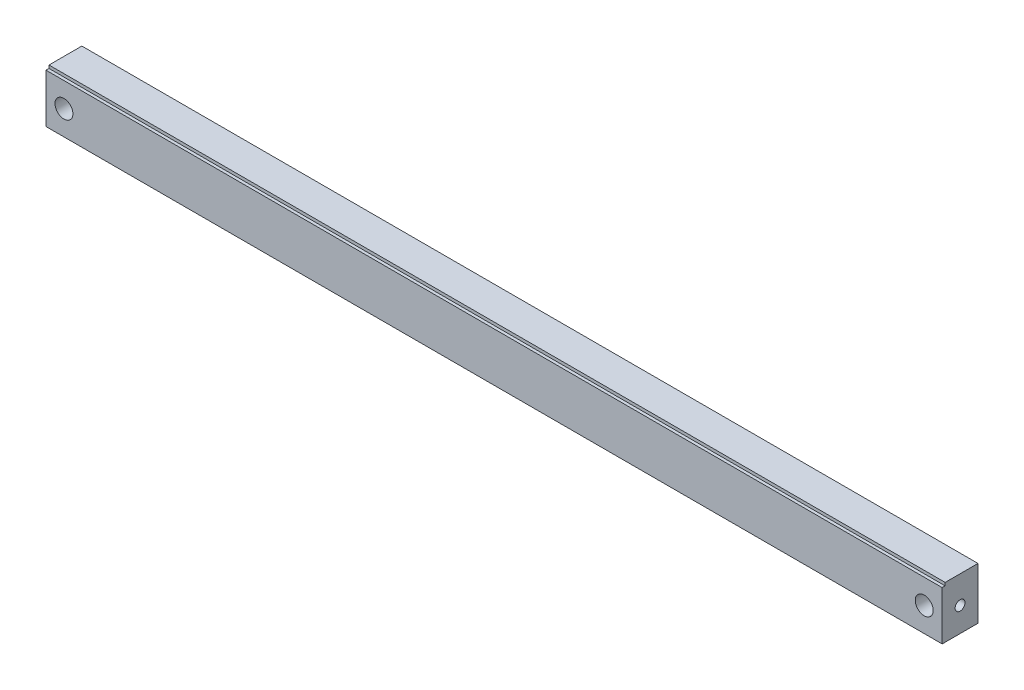
ISO-10303-21;
HEADER;
FILE_DESCRIPTION(('STEP AP214'),'2;1');
FILE_NAME('part.step','',(''),(''),'','','');
FILE_SCHEMA(('AUTOMOTIVE_DESIGN { 1 0 10303 214 1 1 1 1 }'));
ENDSEC;
DATA;
#1=APPLICATION_CONTEXT('core data for automotive mechanical design processes');
#2=APPLICATION_PROTOCOL_DEFINITION('international standard','automotive_design',2000,#1);
#3=PRODUCT_CONTEXT('',#1,'mechanical');
#4=PRODUCT('Part','Part','',(#3));
#5=PRODUCT_RELATED_PRODUCT_CATEGORY('part','',(#4));
#6=PRODUCT_DEFINITION_FORMATION('','',#4);
#7=PRODUCT_DEFINITION_CONTEXT('part definition',#1,'design');
#8=PRODUCT_DEFINITION('design','',#6,#7);
#9=PRODUCT_DEFINITION_SHAPE('','',#8);
#10=(LENGTH_UNIT() NAMED_UNIT(*) SI_UNIT(.MILLI.,.METRE.));
#11=(NAMED_UNIT(*) PLANE_ANGLE_UNIT() SI_UNIT($,.RADIAN.));
#12=(NAMED_UNIT(*) SI_UNIT($,.STERADIAN.) SOLID_ANGLE_UNIT());
#13=UNCERTAINTY_MEASURE_WITH_UNIT(LENGTH_MEASURE(1.E-05),#10,'distance_accuracy_value','');
#14=(GEOMETRIC_REPRESENTATION_CONTEXT(3) GLOBAL_UNCERTAINTY_ASSIGNED_CONTEXT((#13)) GLOBAL_UNIT_ASSIGNED_CONTEXT((#10,
#11,#12)) REPRESENTATION_CONTEXT('',''));
#15=CARTESIAN_POINT('',(0.,0.,0.));
#16=DIRECTION('',(0.,0.,1.));
#17=DIRECTION('',(1.,0.,0.));
#18=AXIS2_PLACEMENT_3D('',#15,#16,#17);
#19=CARTESIAN_POINT('',(-150.,17.35,-12.));
#20=DIRECTION('',(1.,0.,0.));
#21=DIRECTION('',(0.,0.,-1.));
#22=AXIS2_PLACEMENT_3D('',#19,#20,#21);
#23=PLANE('',#22);
#24=CARTESIAN_POINT('',(-150.,8.17500000000004,-6.00000000000003));
#25=DIRECTION('',(-1.,0.,0.));
#26=DIRECTION('',(0.,0.,1.));
#27=AXIS2_PLACEMENT_3D('',#24,#25,#26);
#28=CIRCLE('',#27,1.64999999999999);
#29=CARTESIAN_POINT('',(-150.,8.17500000000004,-4.35000000000004));
#30=VERTEX_POINT('',#29);
#31=EDGE_CURVE('E199',#30,#30,#28,.T.);
#32=ORIENTED_EDGE('',*,*,#31,.F.);
#33=EDGE_LOOP('',(#32));
#34=FACE_BOUND('',#33,.T.);
#35=DIRECTION('',(0.,0.,1.));
#36=VECTOR('',#35,1.);
#37=CARTESIAN_POINT('',(-150.,16.35,0.));
#38=LINE('',#37,#36);
#39=CARTESIAN_POINT('',(-150.,16.35,-1.00000000000003));
#40=VERTEX_POINT('',#39);
#41=CARTESIAN_POINT('',(-150.,16.35,0.));
#42=VERTEX_POINT('',#41);
#43=EDGE_CURVE('E230',#40,#42,#38,.T.);
#44=ORIENTED_EDGE('',*,*,#43,.F.);
#45=DIRECTION('',(0.,1.,0.));
#46=VECTOR('',#45,1.);
#47=CARTESIAN_POINT('',(-150.,16.35,-1.00000000000003));
#48=LINE('',#47,#46);
#49=CARTESIAN_POINT('',(-150.,17.35,-1.00000000000003));
#50=VERTEX_POINT('',#49);
#51=EDGE_CURVE('E119',#40,#50,#48,.T.);
#52=ORIENTED_EDGE('',*,*,#51,.T.);
#53=DIRECTION('',(0.,0.,1.));
#54=VECTOR('',#53,1.);
#55=CARTESIAN_POINT('',(-150.,17.35,-12.));
#56=LINE('',#55,#54);
#57=CARTESIAN_POINT('',(-150.,17.35,-12.));
#58=VERTEX_POINT('',#57);
#59=EDGE_CURVE('E103',#58,#50,#56,.T.);
#60=ORIENTED_EDGE('',*,*,#59,.F.);
#61=DIRECTION('',(0.,-1.,0.));
#62=VECTOR('',#61,1.);
#63=CARTESIAN_POINT('',(-150.,17.35,-12.));
#64=LINE('',#63,#62);
#65=CARTESIAN_POINT('',(-150.,0.,-12.));
#66=VERTEX_POINT('',#65);
#67=EDGE_CURVE('E95',#58,#66,#64,.T.);
#68=ORIENTED_EDGE('',*,*,#67,.T.);
#69=DIRECTION('',(0.,0.,1.));
#70=VECTOR('',#69,1.);
#71=CARTESIAN_POINT('',(-150.,0.,-12.));
#72=LINE('',#71,#70);
#73=CARTESIAN_POINT('',(-150.,0.,0.));
#74=VERTEX_POINT('',#73);
#75=EDGE_CURVE('E110',#66,#74,#72,.T.);
#76=ORIENTED_EDGE('',*,*,#75,.T.);
#77=DIRECTION('',(0.,-1.,0.));
#78=VECTOR('',#77,1.);
#79=CARTESIAN_POINT('',(-150.,17.35,0.));
#80=LINE('',#79,#78);
#81=EDGE_CURVE('E11',#42,#74,#80,.T.);
#82=ORIENTED_EDGE('',*,*,#81,.F.);
#83=EDGE_LOOP('',(#44,#52,#60,#68,#76,#82));
#84=FACE_BOUND('',#83,.T.);
#85=ADVANCED_FACE('F43',(#34,#84),#23,.F.);
#86=CARTESIAN_POINT('',(-150.,17.35,0.));
#87=DIRECTION('',(0.,0.,-1.));
#88=DIRECTION('',(-1.,0.,0.));
#89=AXIS2_PLACEMENT_3D('',#86,#87,#88);
#90=PLANE('',#89);
#91=CARTESIAN_POINT('',(-144.,8.17500000000003,0.));
#92=DIRECTION('',(0.,0.,1.));
#93=DIRECTION('',(1.,0.,0.));
#94=AXIS2_PLACEMENT_3D('',#91,#92,#93);
#95=CIRCLE('',#94,2.99999999999999);
#96=CARTESIAN_POINT('',(-141.,8.17500000000003,0.));
#97=VERTEX_POINT('',#96);
#98=EDGE_CURVE('E218',#97,#97,#95,.T.);
#99=ORIENTED_EDGE('',*,*,#98,.F.);
#100=EDGE_LOOP('',(#99));
#101=FACE_BOUND('',#100,.T.);
#102=CARTESIAN_POINT('',(144.,8.17500000000004,0.));
#103=DIRECTION('',(0.,0.,1.));
#104=DIRECTION('',(1.,0.,0.));
#105=AXIS2_PLACEMENT_3D('',#102,#103,#104);
#106=CIRCLE('',#105,2.99999999999999);
#107=CARTESIAN_POINT('',(147.,8.17500000000004,0.));
#108=VERTEX_POINT('',#107);
#109=EDGE_CURVE('E226',#108,#108,#106,.T.);
#110=ORIENTED_EDGE('',*,*,#109,.F.);
#111=EDGE_LOOP('',(#110));
#112=FACE_BOUND('',#111,.T.);
#113=DIRECTION('',(0.,-1.,0.));
#114=VECTOR('',#113,1.);
#115=CARTESIAN_POINT('',(150.,17.35,0.));
#116=LINE('',#115,#114);
#117=CARTESIAN_POINT('',(150.,16.35,0.));
#118=VERTEX_POINT('',#117);
#119=CARTESIAN_POINT('',(150.,0.,0.));
#120=VERTEX_POINT('',#119);
#121=EDGE_CURVE('E57',#118,#120,#116,.T.);
#122=ORIENTED_EDGE('',*,*,#121,.F.);
#123=DIRECTION('',(1.,0.,0.));
#124=VECTOR('',#123,1.);
#125=CARTESIAN_POINT('',(-150.,16.35,0.));
#126=LINE('',#125,#124);
#127=EDGE_CURVE('E234',#42,#118,#126,.T.);
#128=ORIENTED_EDGE('',*,*,#127,.F.);
#129=ORIENTED_EDGE('',*,*,#81,.T.);
#130=DIRECTION('',(1.,0.,0.));
#131=VECTOR('',#130,1.);
#132=CARTESIAN_POINT('',(-150.,0.,0.));
#133=LINE('',#132,#131);
#134=EDGE_CURVE('E117',#74,#120,#133,.T.);
#135=ORIENTED_EDGE('',*,*,#134,.T.);
#136=EDGE_LOOP('',(#122,#128,#129,#135));
#137=FACE_BOUND('',#136,.T.);
#138=ADVANCED_FACE('F190',(#101,#112,#137),#90,.F.);
#139=CARTESIAN_POINT('',(150.,17.35,-12.0000000000001));
#140=DIRECTION('',(-1.,0.,0.));
#141=DIRECTION('',(0.,0.,1.));
#142=AXIS2_PLACEMENT_3D('',#139,#140,#141);
#143=PLANE('',#142);
#144=CARTESIAN_POINT('',(150.,8.17500000000004,-6.00000000000003));
#145=DIRECTION('',(1.,0.,0.));
#146=DIRECTION('',(0.,0.,-1.));
#147=AXIS2_PLACEMENT_3D('',#144,#145,#146);
#148=CIRCLE('',#147,1.64999999999999);
#149=CARTESIAN_POINT('',(150.,8.17500000000004,-7.65000000000002));
#150=VERTEX_POINT('',#149);
#151=EDGE_CURVE('E206',#150,#150,#148,.T.);
#152=ORIENTED_EDGE('',*,*,#151,.F.);
#153=EDGE_LOOP('',(#152));
#154=FACE_BOUND('',#153,.T.);
#155=DIRECTION('',(0.,0.,-1.));
#156=VECTOR('',#155,1.);
#157=CARTESIAN_POINT('',(150.,17.35,-12.0000000000001));
#158=LINE('',#157,#156);
#159=CARTESIAN_POINT('',(150.,17.35,-1.00000000000003));
#160=VERTEX_POINT('',#159);
#161=CARTESIAN_POINT('',(150.,17.35,-12.0000000000001));
#162=VERTEX_POINT('',#161);
#163=EDGE_CURVE('E251',#160,#162,#158,.T.);
#164=ORIENTED_EDGE('',*,*,#163,.F.);
#165=DIRECTION('',(0.,1.,0.));
#166=VECTOR('',#165,1.);
#167=CARTESIAN_POINT('',(150.,16.35,-1.00000000000003));
#168=LINE('',#167,#166);
#169=CARTESIAN_POINT('',(150.,16.35,-1.00000000000003));
#170=VERTEX_POINT('',#169);
#171=EDGE_CURVE('E65',#170,#160,#168,.T.);
#172=ORIENTED_EDGE('',*,*,#171,.F.);
#173=DIRECTION('',(0.,0.,-1.));
#174=VECTOR('',#173,1.);
#175=CARTESIAN_POINT('',(150.,16.35,0.));
#176=LINE('',#175,#174);
#177=EDGE_CURVE('E238',#118,#170,#176,.T.);
#178=ORIENTED_EDGE('',*,*,#177,.F.);
#179=ORIENTED_EDGE('',*,*,#121,.T.);
#180=DIRECTION('',(0.,0.,-1.));
#181=VECTOR('',#180,1.);
#182=CARTESIAN_POINT('',(150.,0.,-12.0000000000001));
#183=LINE('',#182,#181);
#184=CARTESIAN_POINT('',(150.,0.,-12.0000000000001));
#185=VERTEX_POINT('',#184);
#186=EDGE_CURVE('E104',#120,#185,#183,.T.);
#187=ORIENTED_EDGE('',*,*,#186,.T.);
#188=DIRECTION('',(0.,-1.,0.));
#189=VECTOR('',#188,1.);
#190=CARTESIAN_POINT('',(150.,17.35,-12.0000000000001));
#191=LINE('',#190,#189);
#192=EDGE_CURVE('E98',#162,#185,#191,.T.);
#193=ORIENTED_EDGE('',*,*,#192,.F.);
#194=EDGE_LOOP('',(#164,#172,#178,#179,#187,#193));
#195=FACE_BOUND('',#194,.T.);
#196=ADVANCED_FACE('F195',(#154,#195),#143,.F.);
#197=CARTESIAN_POINT('',(-150.,17.35,-12.));
#198=DIRECTION('',(0.,0.,1.));
#199=DIRECTION('',(1.,0.,0.));
#200=AXIS2_PLACEMENT_3D('',#197,#198,#199);
#201=PLANE('',#200);
#202=CARTESIAN_POINT('',(-144.,8.17500000000003,-12.0000000000001));
#203=DIRECTION('',(0.,0.,1.));
#204=DIRECTION('',(1.,0.,0.));
#205=AXIS2_PLACEMENT_3D('',#202,#203,#204);
#206=CIRCLE('',#205,2.99999999999999);
#207=CARTESIAN_POINT('',(-141.,8.17500000000003,-12.0000000000001));
#208=VERTEX_POINT('',#207);
#209=EDGE_CURVE('E213',#208,#208,#206,.T.);
#210=ORIENTED_EDGE('',*,*,#209,.T.);
#211=EDGE_LOOP('',(#210));
#212=FACE_BOUND('',#211,.T.);
#213=CARTESIAN_POINT('',(144.,8.17500000000004,-12.0000000000001));
#214=DIRECTION('',(0.,0.,1.));
#215=DIRECTION('',(1.,0.,0.));
#216=AXIS2_PLACEMENT_3D('',#213,#214,#215);
#217=CIRCLE('',#216,2.99999999999999);
#218=CARTESIAN_POINT('',(147.,8.17500000000004,-12.0000000000001));
#219=VERTEX_POINT('',#218);
#220=EDGE_CURVE('E222',#219,#219,#217,.T.);
#221=ORIENTED_EDGE('',*,*,#220,.T.);
#222=EDGE_LOOP('',(#221));
#223=FACE_BOUND('',#222,.T.);
#224=DIRECTION('',(-1.,0.,0.));
#225=VECTOR('',#224,1.);
#226=CARTESIAN_POINT('',(-150.,0.,-12.));
#227=LINE('',#226,#225);
#228=EDGE_CURVE('E92',#185,#66,#227,.T.);
#229=ORIENTED_EDGE('',*,*,#228,.T.);
#230=ORIENTED_EDGE('',*,*,#67,.F.);
#231=DIRECTION('',(-1.,0.,0.));
#232=VECTOR('',#231,1.);
#233=CARTESIAN_POINT('',(-150.,17.35,-12.));
#234=LINE('',#233,#232);
#235=EDGE_CURVE('E74',#162,#58,#234,.T.);
#236=ORIENTED_EDGE('',*,*,#235,.F.);
#237=ORIENTED_EDGE('',*,*,#192,.T.);
#238=EDGE_LOOP('',(#229,#230,#236,#237));
#239=FACE_BOUND('',#238,.T.);
#240=ADVANCED_FACE('F94',(#212,#223,#239),#201,.F.);
#241=CARTESIAN_POINT('',(0.,17.35,0.));
#242=DIRECTION('',(0.,1.,0.));
#243=DIRECTION('',(0.,0.,1.));
#244=AXIS2_PLACEMENT_3D('',#241,#242,#243);
#245=PLANE('',#244);
#246=DIRECTION('',(-1.,0.,0.));
#247=VECTOR('',#246,1.);
#248=CARTESIAN_POINT('',(-150.,17.35,-1.00000000000003));
#249=LINE('',#248,#247);
#250=EDGE_CURVE('E217',#160,#50,#249,.T.);
#251=ORIENTED_EDGE('',*,*,#250,.F.);
#252=ORIENTED_EDGE('',*,*,#163,.T.);
#253=ORIENTED_EDGE('',*,*,#235,.T.);
#254=ORIENTED_EDGE('',*,*,#59,.T.);
#255=EDGE_LOOP('',(#251,#252,#253,#254));
#256=FACE_BOUND('',#255,.T.);
#257=ADVANCED_FACE('F255',(#256),#245,.T.);
#258=CARTESIAN_POINT('',(0.,0.,0.));
#259=DIRECTION('',(0.,1.,0.));
#260=DIRECTION('',(0.,0.,1.));
#261=AXIS2_PLACEMENT_3D('',#258,#259,#260);
#262=PLANE('',#261);
#263=ORIENTED_EDGE('',*,*,#75,.F.);
#264=ORIENTED_EDGE('',*,*,#228,.F.);
#265=ORIENTED_EDGE('',*,*,#186,.F.);
#266=ORIENTED_EDGE('',*,*,#134,.F.);
#267=EDGE_LOOP('',(#263,#264,#265,#266));
#268=FACE_BOUND('',#267,.T.);
#269=ADVANCED_FACE('F115',(#268),#262,.F.);
#270=CARTESIAN_POINT('',(-150.,16.35,-1.00000000000003));
#271=DIRECTION('',(0.,0.,-1.));
#272=DIRECTION('',(-1.,0.,0.));
#273=AXIS2_PLACEMENT_3D('',#270,#271,#272);
#274=PLANE('',#273);
#275=ORIENTED_EDGE('',*,*,#250,.T.);
#276=ORIENTED_EDGE('',*,*,#51,.F.);
#277=DIRECTION('',(-1.,0.,0.));
#278=VECTOR('',#277,1.);
#279=CARTESIAN_POINT('',(-150.,16.35,-1.00000000000003));
#280=LINE('',#279,#278);
#281=EDGE_CURVE('E242',#170,#40,#280,.T.);
#282=ORIENTED_EDGE('',*,*,#281,.F.);
#283=ORIENTED_EDGE('',*,*,#171,.T.);
#284=EDGE_LOOP('',(#275,#276,#282,#283));
#285=FACE_BOUND('',#284,.T.);
#286=ADVANCED_FACE('F274',(#285),#274,.F.);
#287=CARTESIAN_POINT('',(0.,16.35,0.));
#288=DIRECTION('',(0.,-1.,0.));
#289=DIRECTION('',(0.,0.,-1.));
#290=AXIS2_PLACEMENT_3D('',#287,#288,#289);
#291=PLANE('',#290);
#292=ORIENTED_EDGE('',*,*,#43,.T.);
#293=ORIENTED_EDGE('',*,*,#127,.T.);
#294=ORIENTED_EDGE('',*,*,#177,.T.);
#295=ORIENTED_EDGE('',*,*,#281,.T.);
#296=EDGE_LOOP('',(#292,#293,#294,#295));
#297=FACE_BOUND('',#296,.T.);
#298=ADVANCED_FACE('F275',(#297),#291,.F.);
#299=CARTESIAN_POINT('',(144.,8.17500000000004,-12.0000000000001));
#300=DIRECTION('',(0.,0.,1.));
#301=DIRECTION('',(1.,0.,0.));
#302=AXIS2_PLACEMENT_3D('',#299,#300,#301);
#303=CYLINDRICAL_SURFACE('',#302,2.99999999999999);
#304=CARTESIAN_POINT('',(147.,8.17500000000004,-7.65000000000003));
#305=CARTESIAN_POINT('',(146.999995138866,8.26066994754534,-7.64999461662171));
#306=CARTESIAN_POINT('',(146.996293022555,8.34640907120568,-7.64328935440905));
#307=CARTESIAN_POINT('',(146.981847839912,8.51528605172608,-7.61679778476966));
#308=CARTESIAN_POINT('',(146.971095162821,8.5984201953799,-7.596993621652));
#309=CARTESIAN_POINT('',(146.943657186953,8.75940157792867,-7.54534553567835));
#310=CARTESIAN_POINT('',(146.926996349565,8.83726906266745,-7.51355122137037));
#311=CARTESIAN_POINT('',(146.889211625298,8.98640824063579,-7.43912133182609));
#312=CARTESIAN_POINT('',(146.868087547751,9.05767965189671,-7.39648529341995));
#313=CARTESIAN_POINT('',(146.821532529935,9.19711619357278,-7.29828466687544));
#314=CARTESIAN_POINT('',(146.795905280133,9.26473037342794,-7.24203247555589));
#315=CARTESIAN_POINT('',(146.743753547228,9.3900863423352,-7.11970839153993));
#316=CARTESIAN_POINT('',(146.717228252778,9.44781890234563,-7.0536274256305));
#317=CARTESIAN_POINT('',(146.6632189583,9.55751917691,-6.90577401407737));
#318=CARTESIAN_POINT('',(146.635897965792,9.6083585771339,-6.82309703851531));
#319=CARTESIAN_POINT('',(146.586783364767,9.69521547735943,-6.6487726343674));
#320=CARTESIAN_POINT('',(146.56498539395,9.73124468911684,-6.55713236514278));
#321=CARTESIAN_POINT('',(146.531634750866,9.78489890926142,-6.37323055157274));
#322=CARTESIAN_POINT('',(146.519521923548,9.80354263347082,-6.2813738465472));
#323=CARTESIAN_POINT('',(146.505589056339,9.82491120631138,-6.09511055144336));
#324=CARTESIAN_POINT('',(146.503754258945,9.827658879153,-6.00070781297605));
#325=CARTESIAN_POINT('',(146.510156467262,9.81790000078868,-5.82757164325046));
#326=CARTESIAN_POINT('',(146.516902993649,9.80765157443428,-5.7486402415007));
#327=CARTESIAN_POINT('',(146.537035275504,9.77618639026898,-5.59387058009678));
#328=CARTESIAN_POINT('',(146.550424054915,9.75496463656913,-5.51803374630593));
#329=CARTESIAN_POINT('',(146.582561309461,9.70187641342518,-5.36951767999914));
#330=CARTESIAN_POINT('',(146.601419105169,9.66979033069665,-5.29694176220774));
#331=CARTESIAN_POINT('',(146.642409024691,9.59607429999092,-5.1578289794032));
#332=CARTESIAN_POINT('',(146.664542560357,9.55444023253665,-5.0912947384181));
#333=CARTESIAN_POINT('',(146.713790408479,9.45518349411559,-4.95510521641992));
#334=CARTESIAN_POINT('',(146.741139571426,9.39607458392547,-4.88661394811565));
#335=CARTESIAN_POINT('',(146.794973778877,9.26724532196505,-4.75997341934868));
#336=CARTESIAN_POINT('',(146.821458222186,9.19751777065967,-4.70183123410762));
#337=CARTESIAN_POINT('',(146.872721340527,9.04360504180097,-4.59378517331666));
#338=CARTESIAN_POINT('',(146.897266481562,8.95876386145308,-4.54469535937112));
#339=CARTESIAN_POINT('',(146.939715283651,8.78035237764527,-4.46191924656257));
#340=CARTESIAN_POINT('',(146.957625185797,8.68679038119604,-4.42821846583335));
#341=CARTESIAN_POINT('',(146.983333456242,8.50290703798102,-4.3803877895618));
#342=CARTESIAN_POINT('',(146.991918227826,8.41309548052334,-4.36472744848252));
#343=CARTESIAN_POINT('',(147.00083376662,8.23173253344256,-4.3484691712931));
#344=CARTESIAN_POINT('',(147.001169808284,8.14018229306561,-4.34786161003825));
#345=CARTESIAN_POINT('',(146.993941778318,7.96751262484919,-4.36103451330558));
#346=CARTESIAN_POINT('',(146.987146595872,7.88624822376261,-4.37341460128183));
#347=CARTESIAN_POINT('',(146.967467938301,7.7271611503752,-4.40984259733268));
#348=CARTESIAN_POINT('',(146.954583847371,7.64933882706214,-4.4338916855665));
#349=CARTESIAN_POINT('',(146.923493780377,7.49724659213414,-4.49335761595172));
#350=CARTESIAN_POINT('',(146.905174751448,7.42309575905467,-4.52901769554696));
#351=CARTESIAN_POINT('',(146.864842151033,7.28163680025034,-4.61037134629977));
#352=CARTESIAN_POINT('',(146.842827229965,7.21433118857594,-4.65606858448364));
#353=CARTESIAN_POINT('',(146.794203315939,7.08044543711096,-4.76204471413839));
#354=CARTESIAN_POINT('',(146.767355923475,7.01478995624187,-4.82338328365903));
#355=CARTESIAN_POINT('',(146.713654407368,6.89420086987217,-4.95592442967753));
#356=CARTESIAN_POINT('',(146.686800305565,6.83927844251288,-5.0271371592824));
#357=CARTESIAN_POINT('',(146.633858755114,6.73752745933344,-5.18416419340716));
#358=CARTESIAN_POINT('',(146.607992957379,6.69165923170706,-5.2706830768754));
#359=CARTESIAN_POINT('',(146.563230639929,6.61557123346221,-5.45199407970869));
#360=CARTESIAN_POINT('',(146.544323980536,6.58532866960537,-5.54677391139995));
#361=CARTESIAN_POINT('',(146.518254204574,6.54437537445964,-5.73226237758555));
#362=CARTESIAN_POINT('',(146.510130221532,6.53205522432926,-5.82247478053952));
#363=CARTESIAN_POINT('',(146.503860935098,6.52250965087715,-6.00401046928807));
#364=CARTESIAN_POINT('',(146.505707066049,6.52527127032743,-6.0953327342726));
#365=CARTESIAN_POINT('',(146.518078706973,6.5442430826308,-6.26321952155554));
#366=CARTESIAN_POINT('',(146.527388741182,6.5585717458307,-6.34010097353316));
#367=CARTESIAN_POINT('',(146.551921457532,6.59758920020128,-6.49019541896001));
#368=CARTESIAN_POINT('',(146.567146568335,6.62228224720226,-6.56340689160004));
#369=CARTESIAN_POINT('',(146.602897492996,6.68294388203804,-6.709139646293));
#370=CARTESIAN_POINT('',(146.623690857268,6.71951045997266,-6.78134399589923));
#371=CARTESIAN_POINT('',(146.667946718017,6.80231490403076,-6.91907602150037));
#372=CARTESIAN_POINT('',(146.691410627914,6.84855790248091,-6.98460012678671));
#373=CARTESIAN_POINT('',(146.742760360377,6.9578499311932,-7.11784973955537));
#374=CARTESIAN_POINT('',(146.770762457364,7.02239735630508,-7.18430823518331));
#375=CARTESIAN_POINT('',(146.824866148571,7.16220648987061,-7.30588442742217));
#376=CARTESIAN_POINT('',(146.850966369645,7.23747582588766,-7.36099398154903));
#377=CARTESIAN_POINT('',(146.899481892702,7.40011273518622,-7.45993803396589));
#378=CARTESIAN_POINT('',(146.921737403504,7.48781010758446,-7.50331356440639));
#379=CARTESIAN_POINT('',(146.958784179001,7.67077635958515,-7.57410971433077));
#380=CARTESIAN_POINT('',(146.973594571533,7.76602510105119,-7.60157124777075));
#381=CARTESIAN_POINT('',(146.989114347566,7.91448938148097,-7.63014205801232));
#382=CARTESIAN_POINT('',(146.993180083346,7.96621694356612,-7.63757243201229));
#383=CARTESIAN_POINT('',(146.998624375946,8.07028772660045,-7.64750301282092));
#384=CARTESIAN_POINT('',(147.000002971556,8.12263093865147,-7.65000329079776));
#385=CARTESIAN_POINT('',(147.,8.17500000000004,-7.65000000000003));
#386=B_SPLINE_CURVE_WITH_KNOTS('',3,(#304,#305,#306,#307,#308,#309,#310,#311,#312,#313,#314,
#315,#316,#317,#318,#319,#320,#321,#322,#323,#324,#325,#326,#327,#328,#329,#330,#331,#332,#333,
#334,#335,#336,#337,#338,#339,#340,#341,#342,#343,#344,#345,#346,#347,#348,#349,#350,#351,#352,
#353,#354,#355,#356,#357,#358,#359,#360,#361,#362,#363,#364,#365,#366,#367,#368,#369,#370,#371,
#372,#373,#374,#375,#376,#377,#378,#379,#380,#381,#382,#383,#384,#385),.UNSPECIFIED.,.T.,.F.,(4,
2,2,2,2,2,2,2,2,2,2,2,2,2,2,2,2,2,2,2,2,2,2,2,2,2,2,2,2,2,2,2,2,2,2,2,2,2,2,2,4),(0.,
0.256799016537927,0.513948810602819,0.770046131883805,1.02615439574975,1.29988051794781,
1.57386091081863,1.87483382859251,2.17556827984511,2.45730761481343,2.73864231615319,
2.97715628850377,3.21577894619803,3.45954576386219,3.70341795322453,3.98576982265921,
4.26831398861796,4.56980790280868,4.87101750814848,5.14417314031284,5.41715410504552,
5.66345591892141,5.90978264803875,6.16164305576707,6.41359563296032,6.69375293580819,
6.97420047673713,7.2764362913265,7.57822997932254,7.85076329691244,8.1230625093144,
8.35830132419626,8.59363682764363,8.84338665158083,9.09326927891539,9.38234984684165,
9.67163710326648,9.97098879991465,10.2695674268337,10.4265480013941,10.5835263098519),.UNSPECIFIED.);
#387=CARTESIAN_POINT('',(147.,8.17500000000004,-7.65000000000003));
#388=VERTEX_POINT('',#387);
#389=EDGE_CURVE('E143',#388,#388,#386,.T.);
#390=ORIENTED_EDGE('',*,*,#389,.T.);
#391=EDGE_LOOP('',(#390));
#392=FACE_BOUND('',#391,.T.);
#393=CARTESIAN_POINT('',(141.,8.17500000000004,-7.65000000000003));
#394=CARTESIAN_POINT('',(141.000004861134,8.08933005245474,-7.64999461662171));
#395=CARTESIAN_POINT('',(141.003706977445,8.0035909287944,-7.64328935440905));
#396=CARTESIAN_POINT('',(141.018152160088,7.834713948274,-7.61679778476967));
#397=CARTESIAN_POINT('',(141.028904837179,7.75157980462018,-7.596993621652));
#398=CARTESIAN_POINT('',(141.056342813047,7.59059842207141,-7.54534553567835));
#399=CARTESIAN_POINT('',(141.073003650435,7.51273093733263,-7.51355122137037));
#400=CARTESIAN_POINT('',(141.110788374702,7.36359175936428,-7.43912133182609));
#401=CARTESIAN_POINT('',(141.131912452248,7.29232034810337,-7.39648529341995));
#402=CARTESIAN_POINT('',(141.178467470065,7.1528838064273,-7.29828466687544));
#403=CARTESIAN_POINT('',(141.204094719867,7.08526962657214,-7.24203247555589));
#404=CARTESIAN_POINT('',(141.256246452772,6.95991365766488,-7.11970839153993));
#405=CARTESIAN_POINT('',(141.282771747222,6.90218109765445,-7.0536274256305));
#406=CARTESIAN_POINT('',(141.3367810417,6.79248082309008,-6.90577401407737));
#407=CARTESIAN_POINT('',(141.364102034208,6.74164142286618,-6.82309703851531));
#408=CARTESIAN_POINT('',(141.413216635233,6.65478452264066,-6.6487726343674));
#409=CARTESIAN_POINT('',(141.43501460605,6.61875531088324,-6.55713236514279));
#410=CARTESIAN_POINT('',(141.468365249134,6.56510109073866,-6.37323055157274));
#411=CARTESIAN_POINT('',(141.480478076452,6.54645736652926,-6.2813738465472));
#412=CARTESIAN_POINT('',(141.494410943661,6.5250887936887,-6.09511055144336));
#413=CARTESIAN_POINT('',(141.496245741055,6.52234112084708,-6.00070781297605));
#414=CARTESIAN_POINT('',(141.489843532738,6.5320999992114,-5.82757164325046));
#415=CARTESIAN_POINT('',(141.483097006351,6.5423484255658,-5.7486402415007));
#416=CARTESIAN_POINT('',(141.462964724496,6.5738136097311,-5.59387058009678));
#417=CARTESIAN_POINT('',(141.449575945085,6.59503536343095,-5.51803374630593));
#418=CARTESIAN_POINT('',(141.417438690539,6.6481235865749,-5.36951767999913));
#419=CARTESIAN_POINT('',(141.398580894831,6.68020966930343,-5.29694176220774));
#420=CARTESIAN_POINT('',(141.357590975309,6.75392570000916,-5.1578289794032));
#421=CARTESIAN_POINT('',(141.335457439643,6.79555976746343,-5.0912947384181));
#422=CARTESIAN_POINT('',(141.286209591521,6.89481650588449,-4.95510521641992));
#423=CARTESIAN_POINT('',(141.258860428574,6.95392541607461,-4.88661394811565));
#424=CARTESIAN_POINT('',(141.205026221123,7.08275467803503,-4.75997341934868));
#425=CARTESIAN_POINT('',(141.178541777814,7.15248222934041,-4.70183123410762));
#426=CARTESIAN_POINT('',(141.127278659473,7.30639495819911,-4.59378517331666));
#427=CARTESIAN_POINT('',(141.102733518438,7.391236138547,-4.54469535937112));
#428=CARTESIAN_POINT('',(141.060284716348,7.56964762235481,-4.46191924656257));
#429=CARTESIAN_POINT('',(141.042374814203,7.66320961880405,-4.42821846583335));
#430=CARTESIAN_POINT('',(141.016666543758,7.84709296201906,-4.3803877895618));
#431=CARTESIAN_POINT('',(141.008081772174,7.93690451947675,-4.36472744848252));
#432=CARTESIAN_POINT('',(140.99916623338,8.11826746655752,-4.3484691712931));
#433=CARTESIAN_POINT('',(140.998830191716,8.20981770693447,-4.34786161003825));
#434=CARTESIAN_POINT('',(141.006058221682,8.38248737515089,-4.36103451330558));
#435=CARTESIAN_POINT('',(141.012853404128,8.46375177623747,-4.37341460128183));
#436=CARTESIAN_POINT('',(141.032532061699,8.62283884962488,-4.40984259733268));
#437=CARTESIAN_POINT('',(141.045416152629,8.70066117293794,-4.4338916855665));
#438=CARTESIAN_POINT('',(141.076506219623,8.85275340786593,-4.49335761595172));
#439=CARTESIAN_POINT('',(141.094825248552,8.92690424094541,-4.52901769554696));
#440=CARTESIAN_POINT('',(141.135157848967,9.06836319974974,-4.61037134629977));
#441=CARTESIAN_POINT('',(141.157172770034,9.13566881142414,-4.65606858448364));
#442=CARTESIAN_POINT('',(141.20579668406,9.26955456288912,-4.76204471413839));
#443=CARTESIAN_POINT('',(141.232644076525,9.33521004375821,-4.82338328365903));
#444=CARTESIAN_POINT('',(141.286345592632,9.45579913012791,-4.95592442967753));
#445=CARTESIAN_POINT('',(141.313199694435,9.51072155748719,-5.0271371592824));
#446=CARTESIAN_POINT('',(141.366141244886,9.61247254066664,-5.18416419340716));
#447=CARTESIAN_POINT('',(141.392007042621,9.65834076829301,-5.2706830768754));
#448=CARTESIAN_POINT('',(141.436769360071,9.73442876653787,-5.45199407970869));
#449=CARTESIAN_POINT('',(141.455676019464,9.76467133039471,-5.54677391139995));
#450=CARTESIAN_POINT('',(141.481745795426,9.80562462554044,-5.73226237758555));
#451=CARTESIAN_POINT('',(141.489869778468,9.81794477567082,-5.82247478053953));
#452=CARTESIAN_POINT('',(141.496139064902,9.82749034912293,-6.00401046928807));
#453=CARTESIAN_POINT('',(141.494292933951,9.82472872967265,-6.0953327342726));
#454=CARTESIAN_POINT('',(141.481921293027,9.80575691736928,-6.26321952155554));
#455=CARTESIAN_POINT('',(141.472611258818,9.79142825416938,-6.34010097353315));
#456=CARTESIAN_POINT('',(141.448078542468,9.7524107997988,-6.49019541896));
#457=CARTESIAN_POINT('',(141.432853431665,9.72771775279783,-6.56340689160003));
#458=CARTESIAN_POINT('',(141.397102507004,9.66705611796204,-6.70913964629299));
#459=CARTESIAN_POINT('',(141.376309142732,9.63048954002742,-6.78134399589922));
#460=CARTESIAN_POINT('',(141.332053281983,9.54768509596933,-6.91907602150037));
#461=CARTESIAN_POINT('',(141.308589372086,9.50144209751917,-6.9846001267867));
#462=CARTESIAN_POINT('',(141.257239639623,9.39215006880689,-7.11784973955536));
#463=CARTESIAN_POINT('',(141.229237542636,9.327602643695,-7.18430823518332));
#464=CARTESIAN_POINT('',(141.175133851429,9.18779351012947,-7.30588442742217));
#465=CARTESIAN_POINT('',(141.149033630355,9.11252417411242,-7.36099398154903));
#466=CARTESIAN_POINT('',(141.100518107298,8.94988726481387,-7.45993803396588));
#467=CARTESIAN_POINT('',(141.078262596495,8.86218989241564,-7.50331356440639));
#468=CARTESIAN_POINT('',(141.041215820999,8.67922364041494,-7.57410971433077));
#469=CARTESIAN_POINT('',(141.026405428467,8.5839748989489,-7.60157124777075));
#470=CARTESIAN_POINT('',(141.010885652434,8.43551061851912,-7.63014205801232));
#471=CARTESIAN_POINT('',(141.006819916654,8.38378305643397,-7.63757243201229));
#472=CARTESIAN_POINT('',(141.001375624054,8.27971227339963,-7.64750301282092));
#473=CARTESIAN_POINT('',(140.999997028444,8.22736906134861,-7.65000329079776));
#474=CARTESIAN_POINT('',(141.,8.17500000000004,-7.65000000000003));
#475=B_SPLINE_CURVE_WITH_KNOTS('',3,(#393,#394,#395,#396,#397,#398,#399,#400,#401,#402,#403,
#404,#405,#406,#407,#408,#409,#410,#411,#412,#413,#414,#415,#416,#417,#418,#419,#420,#421,#422,
#423,#424,#425,#426,#427,#428,#429,#430,#431,#432,#433,#434,#435,#436,#437,#438,#439,#440,#441,
#442,#443,#444,#445,#446,#447,#448,#449,#450,#451,#452,#453,#454,#455,#456,#457,#458,#459,#460,
#461,#462,#463,#464,#465,#466,#467,#468,#469,#470,#471,#472,#473,#474),.UNSPECIFIED.,.T.,.F.,(4,
2,2,2,2,2,2,2,2,2,2,2,2,2,2,2,2,2,2,2,2,2,2,2,2,2,2,2,2,2,2,2,2,2,2,2,2,2,2,2,4),(0.,
0.256799016537922,0.513948810602819,0.770046131883804,1.02615439574975,1.29988051794781,
1.57386091081863,1.87483382859251,2.1755682798451,2.45730761481343,2.73864231615319,
2.97715628850377,3.21577894619803,3.45954576386219,3.70341795322453,3.9857698226592,
4.26831398861796,4.56980790280869,4.8710175081485,5.14417314031285,5.41715410504552,
5.66345591892141,5.90978264803876,6.16164305576707,6.41359563296032,6.69375293580819,
6.97420047673713,7.27643629132651,7.57822997932255,7.85076329691245,8.1230625093144,
8.35830132419627,8.59363682764363,8.84338665158083,9.09326927891539,9.38234984684167,
9.67163710326648,9.97098879991465,10.2695674268337,10.4265480013941,10.5835263098519),.UNSPECIFIED.);
#476=CARTESIAN_POINT('',(141.,8.17500000000004,-7.65000000000003));
#477=VERTEX_POINT('',#476);
#478=EDGE_CURVE('E134',#477,#477,#475,.T.);
#479=ORIENTED_EDGE('',*,*,#478,.T.);
#480=EDGE_LOOP('',(#479));
#481=FACE_BOUND('',#480,.T.);
#482=ORIENTED_EDGE('',*,*,#220,.F.);
#483=EDGE_LOOP('',(#482));
#484=FACE_BOUND('',#483,.T.);
#485=ORIENTED_EDGE('',*,*,#109,.T.);
#486=EDGE_LOOP('',(#485));
#487=FACE_BOUND('',#486,.T.);
#488=ADVANCED_FACE('F148',(#392,#481,#484,#487),#303,.F.);
#489=CARTESIAN_POINT('',(-144.,8.17500000000003,-12.0000000000001));
#490=DIRECTION('',(0.,0.,1.));
#491=DIRECTION('',(1.,0.,0.));
#492=AXIS2_PLACEMENT_3D('',#489,#490,#491);
#493=CYLINDRICAL_SURFACE('',#492,2.99999999999999);
#494=CARTESIAN_POINT('',(-141.,8.17500000000003,-7.65000000000003));
#495=CARTESIAN_POINT('',(-141.000004861134,8.26066994754533,-7.64999461662171));
#496=CARTESIAN_POINT('',(-141.003706977445,8.34640907120568,-7.64328935440905));
#497=CARTESIAN_POINT('',(-141.018152160088,8.51528605172608,-7.61679778476967));
#498=CARTESIAN_POINT('',(-141.028904837179,8.59842019537989,-7.596993621652));
#499=CARTESIAN_POINT('',(-141.056342813047,8.75940157792867,-7.54534553567835));
#500=CARTESIAN_POINT('',(-141.073003650435,8.83726906266745,-7.51355122137037));
#501=CARTESIAN_POINT('',(-141.110788374702,8.98640824063579,-7.43912133182609));
#502=CARTESIAN_POINT('',(-141.131912452248,9.0576796518967,-7.39648529341996));
#503=CARTESIAN_POINT('',(-141.178467470065,9.19711619357278,-7.29828466687544));
#504=CARTESIAN_POINT('',(-141.204094719867,9.26473037342794,-7.24203247555589));
#505=CARTESIAN_POINT('',(-141.256246452772,9.3900863423352,-7.11970839153993));
#506=CARTESIAN_POINT('',(-141.282771747222,9.44781890234563,-7.05362742563051));
#507=CARTESIAN_POINT('',(-141.3367810417,9.55751917690999,-6.90577401407737));
#508=CARTESIAN_POINT('',(-141.364102034208,9.6083585771339,-6.82309703851532));
#509=CARTESIAN_POINT('',(-141.413216635233,9.69521547735942,-6.6487726343674));
#510=CARTESIAN_POINT('',(-141.43501460605,9.73124468911684,-6.55713236514279));
#511=CARTESIAN_POINT('',(-141.468365249134,9.78489890926142,-6.37323055157274));
#512=CARTESIAN_POINT('',(-141.480478076452,9.80354263347082,-6.2813738465472));
#513=CARTESIAN_POINT('',(-141.494410943661,9.82491120631138,-6.09511055144337));
#514=CARTESIAN_POINT('',(-141.496245741055,9.827658879153,-6.00070781297606));
#515=CARTESIAN_POINT('',(-141.489843532738,9.81790000078868,-5.82757164325047));
#516=CARTESIAN_POINT('',(-141.483097006351,9.80765157443428,-5.74864024150071));
#517=CARTESIAN_POINT('',(-141.462964724496,9.77618639026898,-5.59387058009678));
#518=CARTESIAN_POINT('',(-141.449575945085,9.75496463656914,-5.51803374630594));
#519=CARTESIAN_POINT('',(-141.417438690539,9.70187641342518,-5.36951767999914));
#520=CARTESIAN_POINT('',(-141.398580894831,9.66979033069665,-5.29694176220774));
#521=CARTESIAN_POINT('',(-141.357590975309,9.59607429999092,-5.15782897940321));
#522=CARTESIAN_POINT('',(-141.335457439643,9.55444023253665,-5.09129473841811));
#523=CARTESIAN_POINT('',(-141.286209591521,9.45518349411559,-4.95510521641992));
#524=CARTESIAN_POINT('',(-141.258860428574,9.39607458392548,-4.88661394811566));
#525=CARTESIAN_POINT('',(-141.205026221123,9.26724532196506,-4.75997341934869));
#526=CARTESIAN_POINT('',(-141.178541777814,9.19751777065968,-4.70183123410762));
#527=CARTESIAN_POINT('',(-141.127278659473,9.04360504180098,-4.59378517331667));
#528=CARTESIAN_POINT('',(-141.102733518438,8.95876386145309,-4.54469535937112));
#529=CARTESIAN_POINT('',(-141.060284716348,8.78035237764528,-4.46191924656257));
#530=CARTESIAN_POINT('',(-141.042374814203,8.68679038119604,-4.42821846583335));
#531=CARTESIAN_POINT('',(-141.016666543758,8.50290703798102,-4.3803877895618));
#532=CARTESIAN_POINT('',(-141.008081772174,8.41309548052333,-4.36472744848252));
#533=CARTESIAN_POINT('',(-140.99916623338,8.23173253344256,-4.3484691712931));
#534=CARTESIAN_POINT('',(-140.998830191716,8.14018229306561,-4.34786161003825));
#535=CARTESIAN_POINT('',(-141.006058221682,7.96751262484919,-4.36103451330558));
#536=CARTESIAN_POINT('',(-141.012853404128,7.88624822376261,-4.37341460128183));
#537=CARTESIAN_POINT('',(-141.032532061699,7.7271611503752,-4.40984259733268));
#538=CARTESIAN_POINT('',(-141.045416152629,7.64933882706214,-4.4338916855665));
#539=CARTESIAN_POINT('',(-141.076506219623,7.49724659213414,-4.49335761595172));
#540=CARTESIAN_POINT('',(-141.094825248552,7.42309575905467,-4.52901769554696));
#541=CARTESIAN_POINT('',(-141.135157848967,7.28163680025034,-4.61037134629977));
#542=CARTESIAN_POINT('',(-141.157172770034,7.21433118857594,-4.65606858448365));
#543=CARTESIAN_POINT('',(-141.20579668406,7.08044543711095,-4.76204471413839));
#544=CARTESIAN_POINT('',(-141.232644076525,7.01478995624187,-4.82338328365903));
#545=CARTESIAN_POINT('',(-141.286345592632,6.89420086987217,-4.95592442967753));
#546=CARTESIAN_POINT('',(-141.313199694435,6.83927844251288,-5.0271371592824));
#547=CARTESIAN_POINT('',(-141.366141244886,6.73752745933344,-5.18416419340717));
#548=CARTESIAN_POINT('',(-141.392007042621,6.69165923170706,-5.2706830768754));
#549=CARTESIAN_POINT('',(-141.436769360071,6.61557123346221,-5.45199407970869));
#550=CARTESIAN_POINT('',(-141.455676019464,6.58532866960537,-5.54677391139996));
#551=CARTESIAN_POINT('',(-141.481745795426,6.54437537445964,-5.73226237758556));
#552=CARTESIAN_POINT('',(-141.489869778468,6.53205522432926,-5.82247478053953));
#553=CARTESIAN_POINT('',(-141.496139064902,6.52250965087715,-6.00401046928807));
#554=CARTESIAN_POINT('',(-141.494292933951,6.52527127032743,-6.0953327342726));
#555=CARTESIAN_POINT('',(-141.481921293027,6.5442430826308,-6.26321952155554));
#556=CARTESIAN_POINT('',(-141.472611258818,6.5585717458307,-6.34010097353316));
#557=CARTESIAN_POINT('',(-141.448078542468,6.59758920020128,-6.49019541896001));
#558=CARTESIAN_POINT('',(-141.432853431665,6.62228224720225,-6.56340689160004));
#559=CARTESIAN_POINT('',(-141.397102507004,6.68294388203804,-6.709139646293));
#560=CARTESIAN_POINT('',(-141.376309142732,6.71951045997266,-6.78134399589923));
#561=CARTESIAN_POINT('',(-141.332053281983,6.80231490403076,-6.91907602150037));
#562=CARTESIAN_POINT('',(-141.308589372086,6.84855790248091,-6.98460012678671));
#563=CARTESIAN_POINT('',(-141.257239639623,6.95784993119319,-7.11784973955536));
#564=CARTESIAN_POINT('',(-141.229237542636,7.02239735630508,-7.18430823518331));
#565=CARTESIAN_POINT('',(-141.175133851429,7.1622064898706,-7.30588442742217));
#566=CARTESIAN_POINT('',(-141.149033630355,7.23747582588766,-7.36099398154903));
#567=CARTESIAN_POINT('',(-141.100518107298,7.40011273518622,-7.45993803396589));
#568=CARTESIAN_POINT('',(-141.078262596495,7.48781010758446,-7.50331356440639));
#569=CARTESIAN_POINT('',(-141.041215820999,7.67077635958515,-7.57410971433077));
#570=CARTESIAN_POINT('',(-141.026405428467,7.76602510105119,-7.60157124777075));
#571=CARTESIAN_POINT('',(-141.010885652434,7.91448938148097,-7.63014205801232));
#572=CARTESIAN_POINT('',(-141.006819916654,7.96621694356612,-7.63757243201229));
#573=CARTESIAN_POINT('',(-141.001375624054,8.07028772660045,-7.64750301282092));
#574=CARTESIAN_POINT('',(-140.999997028444,8.12263093865146,-7.65000329079776));
#575=CARTESIAN_POINT('',(-141.,8.17500000000003,-7.65000000000003));
#576=B_SPLINE_CURVE_WITH_KNOTS('',3,(#494,#495,#496,#497,#498,#499,#500,#501,#502,#503,#504,
#505,#506,#507,#508,#509,#510,#511,#512,#513,#514,#515,#516,#517,#518,#519,#520,#521,#522,#523,
#524,#525,#526,#527,#528,#529,#530,#531,#532,#533,#534,#535,#536,#537,#538,#539,#540,#541,#542,
#543,#544,#545,#546,#547,#548,#549,#550,#551,#552,#553,#554,#555,#556,#557,#558,#559,#560,#561,
#562,#563,#564,#565,#566,#567,#568,#569,#570,#571,#572,#573,#574,#575),.UNSPECIFIED.,.T.,.F.,(4,
2,2,2,2,2,2,2,2,2,2,2,2,2,2,2,2,2,2,2,2,2,2,2,2,2,2,2,2,2,2,2,2,2,2,2,2,2,2,2,4),(0.,
0.256799016537927,0.513948810602819,0.77004613188381,1.02615439574975,1.29988051794781,
1.57386091081863,1.87483382859251,2.17556827984511,2.45730761481343,2.73864231615319,
2.97715628850377,3.21577894619803,3.45954576386219,3.70341795322452,3.9857698226592,
4.26831398861794,4.56980790280868,4.87101750814849,5.14417314031285,5.41715410504552,
5.66345591892141,5.90978264803876,6.16164305576707,6.41359563296032,6.69375293580819,
6.97420047673713,7.27643629132651,7.57822997932255,7.85076329691245,8.1230625093144,
8.35830132419626,8.59363682764363,8.84338665158083,9.09326927891539,9.38234984684164,
9.67163710326648,9.97098879991465,10.2695674268337,10.4265480013941,10.5835263098519),.UNSPECIFIED.);
#577=CARTESIAN_POINT('',(-141.,8.17500000000003,-7.65000000000003));
#578=VERTEX_POINT('',#577);
#579=EDGE_CURVE('E46',#578,#578,#576,.T.);
#580=ORIENTED_EDGE('',*,*,#579,.T.);
#581=EDGE_LOOP('',(#580));
#582=FACE_BOUND('',#581,.T.);
#583=CARTESIAN_POINT('',(-147.,8.17500000000004,-4.35000000000004));
#584=CARTESIAN_POINT('',(-146.999995138866,8.26066994754534,-4.35000538337835));
#585=CARTESIAN_POINT('',(-146.996293022555,8.34640907120568,-4.35671064559101));
#586=CARTESIAN_POINT('',(-146.981847839912,8.51528605172609,-4.3832022152304));
#587=CARTESIAN_POINT('',(-146.971095162821,8.5984201953799,-4.40300637834807));
#588=CARTESIAN_POINT('',(-146.943657186953,8.75940157792868,-4.45465446432171));
#589=CARTESIAN_POINT('',(-146.926996349565,8.83726906266746,-4.4864487786297));
#590=CARTESIAN_POINT('',(-146.889211625298,8.9864082406358,-4.56087866817398));
#591=CARTESIAN_POINT('',(-146.868087547751,9.05767965189671,-4.60351470658011));
#592=CARTESIAN_POINT('',(-146.821532529935,9.19711619357278,-4.70171533312462));
#593=CARTESIAN_POINT('',(-146.795905280133,9.26473037342794,-4.75796752444418));
#594=CARTESIAN_POINT('',(-146.743753547228,9.3900863423352,-4.88029160846013));
#595=CARTESIAN_POINT('',(-146.717228252778,9.44781890234563,-4.94637257436956));
#596=CARTESIAN_POINT('',(-146.6632189583,9.55751917691,-5.0942259859227));
#597=CARTESIAN_POINT('',(-146.635897965792,9.6083585771339,-5.17690296148475));
#598=CARTESIAN_POINT('',(-146.586783364767,9.69521547735943,-5.35122736563267));
#599=CARTESIAN_POINT('',(-146.56498539395,9.73124468911684,-5.44286763485728));
#600=CARTESIAN_POINT('',(-146.531634750866,9.78489890926142,-5.62676944842733));
#601=CARTESIAN_POINT('',(-146.519521923548,9.80354263347082,-5.71862615345287));
#602=CARTESIAN_POINT('',(-146.505589056339,9.82491120631138,-5.9048894485567));
#603=CARTESIAN_POINT('',(-146.503754258945,9.827658879153,-5.99929218702401));
#604=CARTESIAN_POINT('',(-146.510156467262,9.81790000078868,-6.1724283567496));
#605=CARTESIAN_POINT('',(-146.516902993649,9.80765157443428,-6.25135975849936));
#606=CARTESIAN_POINT('',(-146.537035275504,9.77618639026898,-6.40612941990328));
#607=CARTESIAN_POINT('',(-146.550424054915,9.75496463656913,-6.48196625369413));
#608=CARTESIAN_POINT('',(-146.582561309461,9.70187641342518,-6.63048232000093));
#609=CARTESIAN_POINT('',(-146.601419105169,9.66979033069665,-6.70305823779232));
#610=CARTESIAN_POINT('',(-146.642409024691,9.59607429999092,-6.84217102059686));
#611=CARTESIAN_POINT('',(-146.664542560357,9.55444023253664,-6.90870526158196));
#612=CARTESIAN_POINT('',(-146.713790408479,9.45518349411559,-7.04489478358015));
#613=CARTESIAN_POINT('',(-146.741139571426,9.39607458392547,-7.11338605188442));
#614=CARTESIAN_POINT('',(-146.794973778877,9.26724532196505,-7.24002658065139));
#615=CARTESIAN_POINT('',(-146.821458222186,9.19751777065967,-7.29816876589245));
#616=CARTESIAN_POINT('',(-146.872721340527,9.04360504180097,-7.4062148266834));
#617=CARTESIAN_POINT('',(-146.897266481562,8.95876386145308,-7.45530464062895));
#618=CARTESIAN_POINT('',(-146.939715283651,8.78035237764527,-7.5380807534375));
#619=CARTESIAN_POINT('',(-146.957625185797,8.68679038119603,-7.57178153416672));
#620=CARTESIAN_POINT('',(-146.983333456242,8.50290703798102,-7.61961221043827));
#621=CARTESIAN_POINT('',(-146.991918227826,8.41309548052333,-7.63527255151755));
#622=CARTESIAN_POINT('',(-147.00083376662,8.23173253344256,-7.65153082870696));
#623=CARTESIAN_POINT('',(-147.001169808284,8.14018229306561,-7.65213838996182));
#624=CARTESIAN_POINT('',(-146.993941778318,7.96751262484919,-7.63896548669448));
#625=CARTESIAN_POINT('',(-146.987146595872,7.88624822376261,-7.62658539871824));
#626=CARTESIAN_POINT('',(-146.967467938301,7.7271611503752,-7.59015740266739));
#627=CARTESIAN_POINT('',(-146.954583847371,7.64933882706213,-7.56610831443357));
#628=CARTESIAN_POINT('',(-146.923493780377,7.49724659213414,-7.50664238404834));
#629=CARTESIAN_POINT('',(-146.905174751448,7.42309575905467,-7.47098230445311));
#630=CARTESIAN_POINT('',(-146.864842151033,7.28163680025034,-7.3896286537003));
#631=CARTESIAN_POINT('',(-146.842827229965,7.21433118857594,-7.34393141551642));
#632=CARTESIAN_POINT('',(-146.794203315939,7.08044543711095,-7.23795528586167));
#633=CARTESIAN_POINT('',(-146.767355923475,7.01478995624187,-7.17661671634103));
#634=CARTESIAN_POINT('',(-146.713654407368,6.89420086987217,-7.04407557032254));
#635=CARTESIAN_POINT('',(-146.686800305565,6.83927844251288,-6.97286284071766));
#636=CARTESIAN_POINT('',(-146.633858755114,6.73752745933344,-6.8158358065929));
#637=CARTESIAN_POINT('',(-146.607992957379,6.69165923170706,-6.72931692312466));
#638=CARTESIAN_POINT('',(-146.563230639929,6.61557123346221,-6.54800592029137));
#639=CARTESIAN_POINT('',(-146.544323980536,6.58532866960536,-6.45322608860011));
#640=CARTESIAN_POINT('',(-146.518254204574,6.54437537445964,-6.26773762241451));
#641=CARTESIAN_POINT('',(-146.510130221532,6.53205522432926,-6.17752521946054));
#642=CARTESIAN_POINT('',(-146.503860935098,6.52250965087715,-5.99598953071199));
#643=CARTESIAN_POINT('',(-146.505707066049,6.52527127032743,-5.90466726572747));
#644=CARTESIAN_POINT('',(-146.518078706973,6.5442430826308,-5.73678047844452));
#645=CARTESIAN_POINT('',(-146.527388741182,6.5585717458307,-5.65989902646691));
#646=CARTESIAN_POINT('',(-146.551921457532,6.59758920020128,-5.50980458104005));
#647=CARTESIAN_POINT('',(-146.567146568335,6.62228224720226,-5.43659310840002));
#648=CARTESIAN_POINT('',(-146.602897492996,6.68294388203804,-5.29086035370706));
#649=CARTESIAN_POINT('',(-146.623690857268,6.71951045997266,-5.21865600410084));
#650=CARTESIAN_POINT('',(-146.667946718017,6.80231490403076,-5.0809239784997));
#651=CARTESIAN_POINT('',(-146.691410627914,6.84855790248091,-5.01539987321336));
#652=CARTESIAN_POINT('',(-146.742760360377,6.9578499311932,-4.8821502604447));
#653=CARTESIAN_POINT('',(-146.770762457364,7.02239735630508,-4.81569176481675));
#654=CARTESIAN_POINT('',(-146.824866148571,7.16220648987061,-4.69411557257789));
#655=CARTESIAN_POINT('',(-146.850966369645,7.23747582588766,-4.63900601845104));
#656=CARTESIAN_POINT('',(-146.899481892702,7.40011273518622,-4.54006196603418));
#657=CARTESIAN_POINT('',(-146.921737403504,7.48781010758446,-4.49668643559367));
#658=CARTESIAN_POINT('',(-146.958784179001,7.67077635958515,-4.42589028566929));
#659=CARTESIAN_POINT('',(-146.973594571533,7.76602510105119,-4.39842875222931));
#660=CARTESIAN_POINT('',(-146.989114347566,7.91448938148097,-4.36985794198774));
#661=CARTESIAN_POINT('',(-146.993180083346,7.96621694356612,-4.36242756798778));
#662=CARTESIAN_POINT('',(-146.998624375946,8.07028772660045,-4.35249698717915));
#663=CARTESIAN_POINT('',(-147.000002971556,8.12263093865147,-4.34999670920231));
#664=CARTESIAN_POINT('',(-147.,8.17500000000004,-4.35000000000004));
#665=B_SPLINE_CURVE_WITH_KNOTS('',3,(#583,#584,#585,#586,#587,#588,#589,#590,#591,#592,#593,
#594,#595,#596,#597,#598,#599,#600,#601,#602,#603,#604,#605,#606,#607,#608,#609,#610,#611,#612,
#613,#614,#615,#616,#617,#618,#619,#620,#621,#622,#623,#624,#625,#626,#627,#628,#629,#630,#631,
#632,#633,#634,#635,#636,#637,#638,#639,#640,#641,#642,#643,#644,#645,#646,#647,#648,#649,#650,
#651,#652,#653,#654,#655,#656,#657,#658,#659,#660,#661,#662,#663,#664),.UNSPECIFIED.,.T.,.F.,(4,
2,2,2,2,2,2,2,2,2,2,2,2,2,2,2,2,2,2,2,2,2,2,2,2,2,2,2,2,2,2,2,2,2,2,2,2,2,2,2,4),(0.,
0.256799016537927,0.513948810602819,0.770046131883809,1.02615439574975,1.29988051794781,
1.57386091081863,1.87483382859251,2.17556827984511,2.45730761481343,2.73864231615319,
2.97715628850377,3.21577894619803,3.45954576386219,3.70341795322452,3.98576982265921,
4.26831398861796,4.56980790280868,4.87101750814849,5.14417314031285,5.41715410504552,
5.66345591892141,5.90978264803876,6.16164305576707,6.41359563296032,6.69375293580819,
6.97420047673713,7.27643629132651,7.57822997932255,7.85076329691245,8.1230625093144,
8.35830132419626,8.59363682764363,8.84338665158083,9.09326927891539,9.38234984684165,
9.67163710326648,9.97098879991465,10.2695674268337,10.4265480013941,10.5835263098519),.UNSPECIFIED.);
#666=CARTESIAN_POINT('',(-147.,8.17500000000004,-4.35000000000004));
#667=VERTEX_POINT('',#666);
#668=EDGE_CURVE('E169',#667,#667,#665,.T.);
#669=ORIENTED_EDGE('',*,*,#668,.T.);
#670=EDGE_LOOP('',(#669));
#671=FACE_BOUND('',#670,.T.);
#672=ORIENTED_EDGE('',*,*,#209,.F.);
#673=EDGE_LOOP('',(#672));
#674=FACE_BOUND('',#673,.T.);
#675=ORIENTED_EDGE('',*,*,#98,.T.);
#676=EDGE_LOOP('',(#675));
#677=FACE_BOUND('',#676,.T.);
#678=ADVANCED_FACE('F163',(#582,#671,#674,#677),#493,.F.);
#679=CARTESIAN_POINT('',(140.,8.17500000000004,-6.00000000000003));
#680=DIRECTION('',(1.,0.,0.));
#681=DIRECTION('',(0.,0.,-1.));
#682=AXIS2_PLACEMENT_3D('',#679,#680,#681);
#683=CONICAL_SURFACE('',#682,1.65,1.02974425867666);
#684=CARTESIAN_POINT('',(139.008579978605,8.17500000000004,-6.00000000000003));
#685=VERTEX_POINT('',#684);
#686=VERTEX_LOOP('',#685);
#687=FACE_BOUND('',#686,.T.);
#688=CARTESIAN_POINT('',(140.,8.17500000000004,-6.00000000000003));
#689=DIRECTION('',(1.,0.,0.));
#690=DIRECTION('',(0.,0.,-1.));
#691=AXIS2_PLACEMENT_3D('',#688,#689,#690);
#692=CIRCLE('',#691,1.65);
#693=CARTESIAN_POINT('',(140.,8.17500000000004,-7.65000000000003));
#694=VERTEX_POINT('',#693);
#695=EDGE_CURVE('E144',#694,#694,#692,.T.);
#696=ORIENTED_EDGE('',*,*,#695,.T.);
#697=EDGE_LOOP('',(#696));
#698=FACE_BOUND('',#697,.T.);
#699=ADVANCED_FACE('F160',(#687,#698),#683,.F.);
#700=CARTESIAN_POINT('',(150.,8.17500000000004,-6.00000000000003));
#701=DIRECTION('',(1.,0.,0.));
#702=DIRECTION('',(0.,0.,-1.));
#703=AXIS2_PLACEMENT_3D('',#700,#701,#702);
#704=CYLINDRICAL_SURFACE('',#703,1.64999999999999);
#705=ORIENTED_EDGE('',*,*,#695,.F.);
#706=EDGE_LOOP('',(#705));
#707=FACE_BOUND('',#706,.T.);
#708=ORIENTED_EDGE('',*,*,#478,.F.);
#709=EDGE_LOOP('',(#708));
#710=FACE_BOUND('',#709,.T.);
#711=ADVANCED_FACE('F157',(#707,#710),#704,.F.);
#712=ORIENTED_EDGE('',*,*,#151,.T.);
#713=EDGE_LOOP('',(#712));
#714=FACE_BOUND('',#713,.T.);
#715=ORIENTED_EDGE('',*,*,#389,.F.);
#716=EDGE_LOOP('',(#715));
#717=FACE_BOUND('',#716,.T.);
#718=ADVANCED_FACE('F151',(#714,#717),#704,.F.);
#719=CARTESIAN_POINT('',(-150.,8.17500000000004,-6.00000000000003));
#720=DIRECTION('',(-1.,0.,0.));
#721=DIRECTION('',(0.,0.,1.));
#722=AXIS2_PLACEMENT_3D('',#719,#720,#721);
#723=CYLINDRICAL_SURFACE('',#722,1.64999999999999);
#724=ORIENTED_EDGE('',*,*,#31,.T.);
#725=EDGE_LOOP('',(#724));
#726=FACE_BOUND('',#725,.T.);
#727=ORIENTED_EDGE('',*,*,#668,.F.);
#728=EDGE_LOOP('',(#727));
#729=FACE_BOUND('',#728,.T.);
#730=ADVANCED_FACE('F156',(#726,#729),#723,.F.);
#731=CARTESIAN_POINT('',(-140.,8.17500000000004,-6.00000000000003));
#732=DIRECTION('',(-1.,0.,0.));
#733=DIRECTION('',(0.,0.,1.));
#734=AXIS2_PLACEMENT_3D('',#731,#732,#733);
#735=CIRCLE('',#734,1.65);
#736=CARTESIAN_POINT('',(-140.,8.17500000000004,-4.35000000000003));
#737=VERTEX_POINT('',#736);
#738=EDGE_CURVE('E175',#737,#737,#735,.T.);
#739=ORIENTED_EDGE('',*,*,#738,.F.);
#740=EDGE_LOOP('',(#739));
#741=FACE_BOUND('',#740,.T.);
#742=ORIENTED_EDGE('',*,*,#579,.F.);
#743=EDGE_LOOP('',(#742));
#744=FACE_BOUND('',#743,.T.);
#745=ADVANCED_FACE('F176',(#741,#744),#723,.F.);
#746=CARTESIAN_POINT('',(-140.,8.17500000000004,-6.00000000000003));
#747=DIRECTION('',(-1.,0.,0.));
#748=DIRECTION('',(0.,0.,1.));
#749=AXIS2_PLACEMENT_3D('',#746,#747,#748);
#750=CONICAL_SURFACE('',#749,1.65,1.02974425867666);
#751=CARTESIAN_POINT('',(-139.008579978605,8.17500000000004,-6.00000000000003));
#752=VERTEX_POINT('',#751);
#753=VERTEX_LOOP('',#752);
#754=FACE_BOUND('',#753,.T.);
#755=ORIENTED_EDGE('',*,*,#738,.T.);
#756=EDGE_LOOP('',(#755));
#757=FACE_BOUND('',#756,.T.);
#758=ADVANCED_FACE('F159',(#754,#757),#750,.F.);
#759=CLOSED_SHELL('',(#85,#138,#196,#240,#257,#269,#286,#298,#488,#678,#699,#711,#718,#730,#745,#758));
#760=MANIFOLD_SOLID_BREP('B2',#759);
#761=ADVANCED_BREP_SHAPE_REPRESENTATION('',(#18,#760),#14);
#762=SHAPE_DEFINITION_REPRESENTATION(#9,#761);
ENDSEC;
END-ISO-10303-21;
